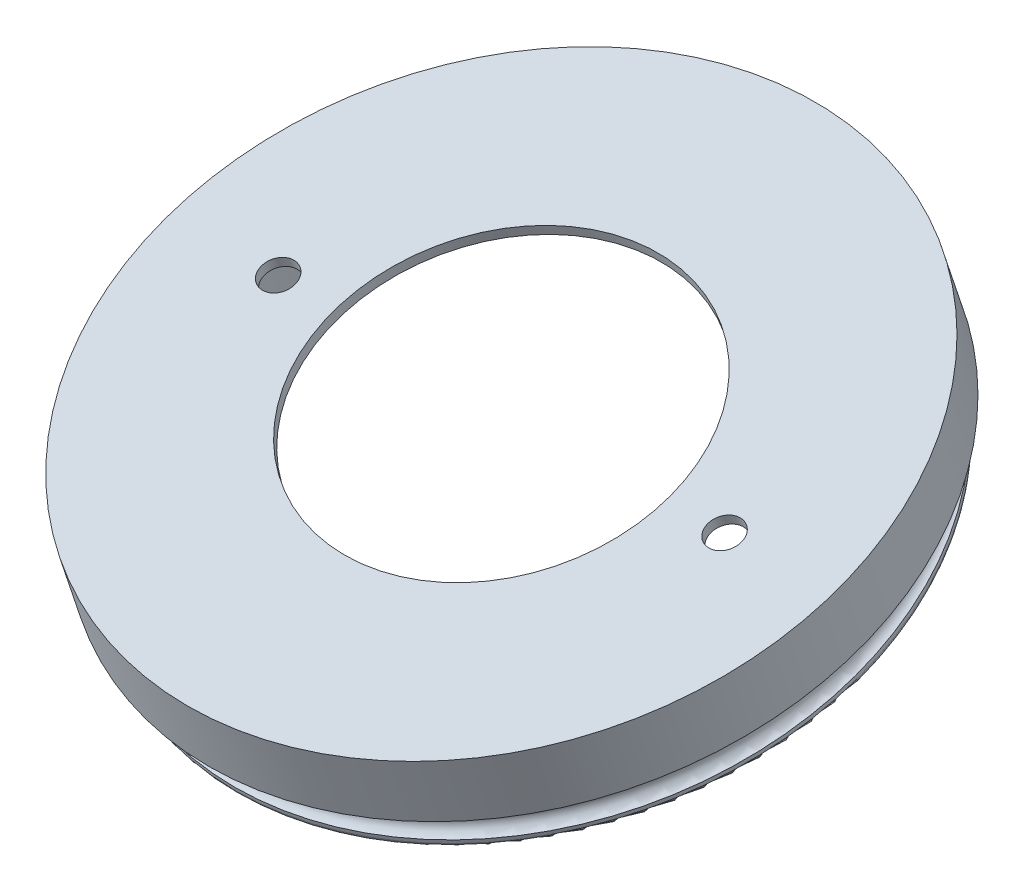
ISO-10303-21;
HEADER;
FILE_DESCRIPTION(('STEP AP214'),'2;1');
FILE_NAME('part.step','',(''),(''),'','','');
FILE_SCHEMA(('AUTOMOTIVE_DESIGN { 1 0 10303 214 1 1 1 1 }'));
ENDSEC;
DATA;
#1=APPLICATION_CONTEXT('core data for automotive mechanical design processes');
#2=APPLICATION_PROTOCOL_DEFINITION('international standard','automotive_design',2000,#1);
#3=PRODUCT_CONTEXT('',#1,'mechanical');
#4=PRODUCT('Part','Part','',(#3));
#5=PRODUCT_RELATED_PRODUCT_CATEGORY('part','',(#4));
#6=PRODUCT_DEFINITION_FORMATION('','',#4);
#7=PRODUCT_DEFINITION_CONTEXT('part definition',#1,'design');
#8=PRODUCT_DEFINITION('design','',#6,#7);
#9=PRODUCT_DEFINITION_SHAPE('','',#8);
#10=(LENGTH_UNIT() NAMED_UNIT(*) SI_UNIT(.MILLI.,.METRE.));
#11=(NAMED_UNIT(*) PLANE_ANGLE_UNIT() SI_UNIT($,.RADIAN.));
#12=(NAMED_UNIT(*) SI_UNIT($,.STERADIAN.) SOLID_ANGLE_UNIT());
#13=UNCERTAINTY_MEASURE_WITH_UNIT(LENGTH_MEASURE(1.E-05),#10,'distance_accuracy_value','');
#14=(GEOMETRIC_REPRESENTATION_CONTEXT(3) GLOBAL_UNCERTAINTY_ASSIGNED_CONTEXT((#13)) GLOBAL_UNIT_ASSIGNED_CONTEXT((#10,
#11,#12)) REPRESENTATION_CONTEXT('',''));
#15=CARTESIAN_POINT('',(0.,0.,0.));
#16=DIRECTION('',(0.,0.,1.));
#17=DIRECTION('',(1.,0.,0.));
#18=AXIS2_PLACEMENT_3D('',#15,#16,#17);
#19=CARTESIAN_POINT('',(0.,0.,0.));
#20=DIRECTION('',(0.,0.948323655206198,0.317304656405097));
#21=DIRECTION('',(0.,-0.317304656405097,0.948323655206198));
#22=AXIS2_PLACEMENT_3D('',#19,#20,#21);
#23=CYLINDRICAL_SURFACE('',#22,38.6);
#24=CARTESIAN_POINT('',(0.,-36.4230710925021,-12.1869891094427));
#25=DIRECTION('',(0.,0.948323655206198,0.317304656405097));
#26=DIRECTION('',(0.,-0.317304656405097,0.948323655206198));
#27=AXIS2_PLACEMENT_3D('',#24,#25,#26);
#28=CIRCLE('',#27,38.6);
#29=CARTESIAN_POINT('',(0.,-48.6710308297389,24.4183039815166));
#30=VERTEX_POINT('',#29);
#31=EDGE_CURVE('E38',#30,#30,#28,.T.);
#32=ORIENTED_EDGE('',*,*,#31,.T.);
#33=EDGE_LOOP('',(#32));
#34=FACE_BOUND('',#33,.T.);
#35=CARTESIAN_POINT('',(0.,-36.8004583771146,-12.3132611285136));
#36=DIRECTION('',(0.,-0.948323655206198,-0.317304656405097));
#37=DIRECTION('',(0.,0.317304656405097,-0.948323655206198));
#38=AXIS2_PLACEMENT_3D('',#35,#36,#37);
#39=CIRCLE('',#38,38.6);
#40=CARTESIAN_POINT('',(0.,-24.5524986398779,-48.9185542194728));
#41=VERTEX_POINT('',#40);
#42=EDGE_CURVE('E42',#41,#41,#39,.T.);
#43=ORIENTED_EDGE('',*,*,#42,.T.);
#44=EDGE_LOOP('',(#43));
#45=FACE_BOUND('',#44,.T.);
#46=ADVANCED_FACE('F31',(#34,#45),#23,.F.);
#47=CARTESIAN_POINT('',(0.,-27.361700493127,-46.8258254924242));
#48=DIRECTION('',(0.,-0.948323655206198,-0.317304656405097));
#49=DIRECTION('',(0.,0.317304656405097,-0.948323655206198));
#50=AXIS2_PLACEMENT_3D('',#47,#48,#49);
#51=PLANE('',#50);
#52=CARTESIAN_POINT('',(0.,-38.697105687527,-12.9478704413238));
#53=DIRECTION('',(0.,-0.948323655206198,-0.317304656405097));
#54=DIRECTION('',(0.,0.317304656405097,-0.948323655206198));
#55=AXIS2_PLACEMENT_3D('',#52,#53,#54);
#56=CIRCLE('',#55,36.6);
#57=CARTESIAN_POINT('',(0.,-27.0837552631004,-47.6565162218706));
#58=VERTEX_POINT('',#57);
#59=EDGE_CURVE('E10',#58,#58,#56,.F.);
#60=ORIENTED_EDGE('',*,*,#59,.T.);
#61=EDGE_LOOP('',(#60));
#62=FACE_BOUND('',#61,.T.);
#63=CARTESIAN_POINT('',(0.,-38.697105687527,-12.9478704413238));
#64=DIRECTION('',(0.,0.948323655206198,0.317304656405097));
#65=DIRECTION('',(0.,-0.317304656405097,0.948323655206198));
#66=AXIS2_PLACEMENT_3D('',#63,#64,#65);
#67=CIRCLE('',#66,35.7240430153924);
#68=CARTESIAN_POINT('',(0.,-50.032510881927,20.9300846097766));
#69=VERTEX_POINT('',#68);
#70=EDGE_CURVE('E63',#69,#69,#67,.T.);
#71=ORIENTED_EDGE('',*,*,#70,.F.);
#72=EDGE_LOOP('',(#71));
#73=FACE_BOUND('',#72,.T.);
#74=ADVANCED_FACE('F137',(#62,#73),#51,.F.);
#75=CARTESIAN_POINT('',(0.,0.,0.));
#76=DIRECTION('',(0.,0.948323655206198,0.317304656405097));
#77=DIRECTION('',(0.,-0.317304656405097,0.948323655206198));
#78=AXIS2_PLACEMENT_3D('',#75,#76,#77);
#79=CYLINDRICAL_SURFACE('',#78,35.7240430153924);
#80=CARTESIAN_POINT('',(0.,-46.2836949291766,-15.4863076925646));
#81=DIRECTION('',(0.,0.948323655206198,0.317304656405097));
#82=DIRECTION('',(0.,-0.317304656405097,0.948323655206198));
#83=AXIS2_PLACEMENT_3D('',#80,#81,#82);
#84=CIRCLE('',#83,35.7240430153924);
#85=CARTESIAN_POINT('',(0.,-57.6191001235765,18.3916473585358));
#86=VERTEX_POINT('',#85);
#87=EDGE_CURVE('E66',#86,#86,#84,.T.);
#88=ORIENTED_EDGE('',*,*,#87,.F.);
#89=EDGE_LOOP('',(#88));
#90=FACE_BOUND('',#89,.T.);
#91=ORIENTED_EDGE('',*,*,#70,.T.);
#92=EDGE_LOOP('',(#91));
#93=FACE_BOUND('',#92,.T.);
#94=ADVANCED_FACE('F142',(#90,#93),#79,.F.);
#95=CARTESIAN_POINT('',(0.,-34.1550280937638,-51.7350718816804));
#96=DIRECTION('',(0.,0.948323655206198,0.317304656405097));
#97=DIRECTION('',(0.,-0.317304656405097,0.948323655206198));
#98=AXIS2_PLACEMENT_3D('',#95,#96,#97);
#99=PLANE('',#98);
#100=CARTESIAN_POINT('',(0.,-46.2836949291765,-15.4863076925646));
#101=DIRECTION('',(0.,0.948323655206198,0.317304656405097));
#102=DIRECTION('',(0.,-0.317304656405097,0.948323655206198));
#103=AXIS2_PLACEMENT_3D('',#100,#101,#102);
#104=CIRCLE('',#103,37.6240430153924);
#105=CARTESIAN_POINT('',(0.,-58.2219789707462,20.1934623034275));
#106=VERTEX_POINT('',#105);
#107=EDGE_CURVE('E51',#106,#106,#104,.F.);
#108=ORIENTED_EDGE('',*,*,#107,.T.);
#109=EDGE_LOOP('',(#108));
#110=FACE_BOUND('',#109,.T.);
#111=ORIENTED_EDGE('',*,*,#87,.T.);
#112=EDGE_LOOP('',(#111));
#113=FACE_BOUND('',#112,.T.);
#114=ADVANCED_FACE('F164',(#110,#113),#99,.F.);
#115=CARTESIAN_POINT('',(0.,0.,0.));
#116=DIRECTION('',(0.,0.948323655206198,0.317304656405097));
#117=DIRECTION('',(0.,-0.317304656405097,0.948323655206198));
#118=AXIS2_PLACEMENT_3D('',#115,#116,#117);
#119=CYLINDRICAL_SURFACE('',#118,38.2240430153924);
#120=CARTESIAN_POINT('',(0.,-45.7147007360528,-15.2959248987215));
#121=DIRECTION('',(0.,0.948323655206198,0.317304656405097));
#122=DIRECTION('',(0.,-0.317304656405097,0.948323655206198));
#123=AXIS2_PLACEMENT_3D('',#120,#121,#122);
#124=CIRCLE('',#123,38.2240430153924);
#125=CARTESIAN_POINT('',(0.,-57.8433675714655,20.9528392903943));
#126=VERTEX_POINT('',#125);
#127=EDGE_CURVE('E54',#126,#126,#124,.T.);
#128=ORIENTED_EDGE('',*,*,#127,.T.);
#129=EDGE_LOOP('',(#128));
#130=FACE_BOUND('',#129,.T.);
#131=CARTESIAN_POINT('',(0.,-45.2618624236965,-15.1444073189159));
#132=DIRECTION('',(0.,0.948323655206198,0.317304656405097));
#133=DIRECTION('',(0.,-0.317304656405097,0.948323655206198));
#134=AXIS2_PLACEMENT_3D('',#131,#132,#133);
#135=CIRCLE('',#134,38.2240430153924);
#136=CARTESIAN_POINT('',(0.,-57.3905292591092,21.1043568702));
#137=VERTEX_POINT('',#136);
#138=EDGE_CURVE('E69',#137,#137,#135,.T.);
#139=ORIENTED_EDGE('',*,*,#138,.F.);
#140=EDGE_LOOP('',(#139));
#141=FACE_BOUND('',#140,.T.);
#142=ADVANCED_FACE('F160',(#130,#141),#119,.T.);
#143=CARTESIAN_POINT('',(0.,-43.912885791161,-14.6930460515518));
#144=DIRECTION('',(0.,0.948323655206198,0.317304656405097));
#145=DIRECTION('',(0.,-0.317304656405097,0.948323655206198));
#146=AXIS2_PLACEMENT_3D('',#143,#144,#145);
#147=TOROIDAL_SURFACE('',#146,38.7,1.5);
#148=CARTESIAN_POINT('',(0.,-42.5496968326323,-14.2369294064312));
#149=DIRECTION('',(0.,-0.948323655206198,-0.317304656405097));
#150=DIRECTION('',(0.,0.317304656405097,-0.948323655206198));
#151=AXIS2_PLACEMENT_3D('',#148,#149,#150);
#152=CIRCLE('',#151,38.2714285714287);
#153=CARTESIAN_POINT('',(0.,-30.4059943396429,-50.5306304392514));
#154=VERTEX_POINT('',#153);
#155=EDGE_CURVE('E57',#154,#154,#152,.T.);
#156=ORIENTED_EDGE('',*,*,#155,.T.);
#157=EDGE_LOOP('',(#156));
#158=FACE_BOUND('',#157,.T.);
#159=ORIENTED_EDGE('',*,*,#138,.T.);
#160=EDGE_LOOP('',(#159));
#161=FACE_BOUND('',#160,.T.);
#162=ADVANCED_FACE('F156',(#158,#161),#147,.F.);
#163=CARTESIAN_POINT('',(0.,0.,0.));
#164=DIRECTION('',(0.,0.948323655206198,0.317304656405097));
#165=DIRECTION('',(0.,-0.317304656405097,0.948323655206198));
#166=AXIS2_PLACEMENT_3D('',#163,#164,#165);
#167=CYLINDRICAL_SURFACE('',#166,38.7);
#168=CARTESIAN_POINT('',(0.,-42.0044212492201,-14.0544827483827));
#169=DIRECTION('',(0.,-0.948323655206198,-0.317304656405097));
#170=DIRECTION('',(0.,0.317304656405097,-0.948323655206198));
#171=AXIS2_PLACEMENT_3D('',#168,#169,#170);
#172=CIRCLE('',#171,38.7);
#173=CARTESIAN_POINT('',(0.,-29.7247310463429,-50.7546082048626));
#174=VERTEX_POINT('',#173);
#175=EDGE_CURVE('E60',#174,#174,#172,.F.);
#176=ORIENTED_EDGE('',*,*,#175,.T.);
#177=EDGE_LOOP('',(#176));
#178=FACE_BOUND('',#177,.T.);
#179=CARTESIAN_POINT('',(0.,-40.9730824600218,-13.709401616696));
#180=DIRECTION('',(0.,0.948323655206198,0.317304656405097));
#181=DIRECTION('',(0.,-0.317304656405097,0.948323655206198));
#182=AXIS2_PLACEMENT_3D('',#179,#180,#181);
#183=CIRCLE('',#182,38.7);
#184=CARTESIAN_POINT('',(0.,-53.2527726628991,22.9907238397838));
#185=VERTEX_POINT('',#184);
#186=EDGE_CURVE('E72',#185,#185,#183,.T.);
#187=ORIENTED_EDGE('',*,*,#186,.F.);
#188=EDGE_LOOP('',(#187));
#189=FACE_BOUND('',#188,.T.);
#190=ADVANCED_FACE('F152',(#178,#189),#167,.T.);
#191=CARTESIAN_POINT('',(0.,-28.280896203818,-51.6423478249439));
#192=DIRECTION('',(0.,0.948323655206198,0.317304656405097));
#193=DIRECTION('',(0.,-0.317304656405097,0.948323655206198));
#194=AXIS2_PLACEMENT_3D('',#191,#192,#193);
#195=PLANE('',#194);
#196=CARTESIAN_POINT('',(0.,-40.9730824600218,-13.709401616696));
#197=DIRECTION('',(0.,0.948323655206198,0.317304656405097));
#198=DIRECTION('',(0.,-0.317304656405097,0.948323655206198));
#199=AXIS2_PLACEMENT_3D('',#196,#197,#198);
#200=CIRCLE('',#199,40.);
#201=CARTESIAN_POINT('',(0.,-53.6652687162257,24.2235445915519));
#202=VERTEX_POINT('',#201);
#203=EDGE_CURVE('E75',#202,#202,#200,.T.);
#204=ORIENTED_EDGE('',*,*,#203,.F.);
#205=EDGE_LOOP('',(#204));
#206=FACE_BOUND('',#205,.T.);
#207=ORIENTED_EDGE('',*,*,#186,.T.);
#208=EDGE_LOOP('',(#207));
#209=FACE_BOUND('',#208,.T.);
#210=ADVANCED_FACE('F148',(#206,#209),#195,.F.);
#211=CARTESIAN_POINT('',(0.,0.,0.));
#212=DIRECTION('',(0.,0.948323655206198,0.317304656405097));
#213=DIRECTION('',(0.,-0.317304656405097,0.948323655206198));
#214=AXIS2_PLACEMENT_3D('',#211,#212,#213);
#215=CYLINDRICAL_SURFACE('',#214,40.);
#216=CARTESIAN_POINT('',(0.,-33.3884353958423,-11.1716142089464));
#217=DIRECTION('',(0.,0.948323655206198,0.317304656405097));
#218=DIRECTION('',(0.,-0.317304656405097,0.948323655206198));
#219=AXIS2_PLACEMENT_3D('',#216,#217,#218);
#220=CIRCLE('',#219,40.);
#221=CARTESIAN_POINT('',(0.,-46.0806216520461,26.7613319993016));
#222=VERTEX_POINT('',#221);
#223=EDGE_CURVE('E78',#222,#222,#220,.T.);
#224=ORIENTED_EDGE('',*,*,#223,.F.);
#225=EDGE_LOOP('',(#224));
#226=FACE_BOUND('',#225,.T.);
#227=ORIENTED_EDGE('',*,*,#203,.T.);
#228=EDGE_LOOP('',(#227));
#229=FACE_BOUND('',#228,.T.);
#230=ADVANCED_FACE('F115',(#226,#229),#215,.T.);
#231=CARTESIAN_POINT('',(0.,-21.1404756586055,-47.7769072999056));
#232=DIRECTION('',(0.,-0.948323655206198,-0.317304656405097));
#233=DIRECTION('',(0.,0.317304656405097,-0.948323655206198));
#234=AXIS2_PLACEMENT_3D('',#231,#232,#233);
#235=PLANE('',#234);
#236=ORIENTED_EDGE('',*,*,#223,.T.);
#237=EDGE_LOOP('',(#236));
#238=FACE_BOUND('',#237,.T.);
#239=CARTESIAN_POINT('',(27.,-33.3884353958423,-11.1716142089464));
#240=DIRECTION('',(0.,0.948323655206198,0.317304656405097));
#241=DIRECTION('',(0.,-0.317304656405097,0.948323655206198));
#242=AXIS2_PLACEMENT_3D('',#239,#240,#241);
#243=CIRCLE('',#242,2.);
#244=CARTESIAN_POINT('',(27.,-34.0230447086525,-9.27496689853397));
#245=VERTEX_POINT('',#244);
#246=EDGE_CURVE('E94',#245,#245,#243,.T.);
#247=ORIENTED_EDGE('',*,*,#246,.F.);
#248=EDGE_LOOP('',(#247));
#249=FACE_BOUND('',#248,.T.);
#250=CARTESIAN_POINT('',(-27.,-33.3884353958423,-11.1716142089464));
#251=DIRECTION('',(0.,0.948323655206198,0.317304656405097));
#252=DIRECTION('',(0.,-0.317304656405097,0.948323655206198));
#253=AXIS2_PLACEMENT_3D('',#250,#251,#252);
#254=CIRCLE('',#253,2.);
#255=CARTESIAN_POINT('',(-27.,-34.0230447086525,-9.27496689853397));
#256=VERTEX_POINT('',#255);
#257=EDGE_CURVE('E88',#256,#256,#254,.T.);
#258=ORIENTED_EDGE('',*,*,#257,.F.);
#259=EDGE_LOOP('',(#258));
#260=FACE_BOUND('',#259,.T.);
#261=CARTESIAN_POINT('',(0.,-33.3884353958423,-11.1716142089464));
#262=DIRECTION('',(0.,0.948323655206198,0.317304656405097));
#263=DIRECTION('',(0.,-0.317304656405097,0.948323655206198));
#264=AXIS2_PLACEMENT_3D('',#261,#262,#263);
#265=CIRCLE('',#264,20.);
#266=CARTESIAN_POINT('',(0.,-39.7345285239442,7.7948588951776));
#267=VERTEX_POINT('',#266);
#268=EDGE_CURVE('E82',#267,#267,#265,.T.);
#269=ORIENTED_EDGE('',*,*,#268,.F.);
#270=EDGE_LOOP('',(#269));
#271=FACE_BOUND('',#270,.T.);
#272=ADVANCED_FACE('F111',(#238,#249,#260,#271),#235,.F.);
#273=CARTESIAN_POINT('',(0.,-42.0044212492201,-14.0544827483827));
#274=DIRECTION('',(0.,-0.948323655206198,-0.317304656405097));
#275=DIRECTION('',(0.,0.317304656405097,-0.948323655206198));
#276=AXIS2_PLACEMENT_3D('',#273,#274,#275);
#277=TOROIDAL_SURFACE('',#276,38.1,0.6);
#278=ORIENTED_EDGE('',*,*,#155,.F.);
#279=EDGE_LOOP('',(#278));
#280=FACE_BOUND('',#279,.T.);
#281=ORIENTED_EDGE('',*,*,#175,.F.);
#282=EDGE_LOOP('',(#281));
#283=FACE_BOUND('',#282,.T.);
#284=ADVANCED_FACE('F114',(#280,#283),#277,.T.);
#285=CARTESIAN_POINT('',(0.,-45.7147007360528,-15.2959248987215));
#286=DIRECTION('',(0.,0.948323655206198,0.317304656405097));
#287=DIRECTION('',(0.,-0.317304656405097,0.948323655206198));
#288=AXIS2_PLACEMENT_3D('',#285,#286,#287);
#289=TOROIDAL_SURFACE('',#288,37.6240430153924,0.6);
#290=ORIENTED_EDGE('',*,*,#107,.F.);
#291=EDGE_LOOP('',(#290));
#292=FACE_BOUND('',#291,.T.);
#293=ORIENTED_EDGE('',*,*,#127,.F.);
#294=EDGE_LOOP('',(#293));
#295=FACE_BOUND('',#294,.T.);
#296=ADVANCED_FACE('F132',(#292,#295),#289,.T.);
#297=CARTESIAN_POINT('',(0.,-34.5264237820897,-11.5523797966325));
#298=DIRECTION('',(0.,0.948323655206198,0.317304656405097));
#299=DIRECTION('',(0.,-0.317304656405097,0.948323655206198));
#300=AXIS2_PLACEMENT_3D('',#297,#298,#299);
#301=PLANE('',#300);
#302=CARTESIAN_POINT('',(0.,-34.5264237820897,-11.5523797966325));
#303=DIRECTION('',(0.,0.948323655206198,0.317304656405097));
#304=DIRECTION('',(0.,-0.317304656405097,0.948323655206198));
#305=AXIS2_PLACEMENT_3D('',#302,#303,#304);
#306=CIRCLE('',#305,36.6);
#307=CARTESIAN_POINT('',(0.,-46.1397742065163,23.1562659839144));
#308=VERTEX_POINT('',#307);
#309=EDGE_CURVE('E46',#308,#308,#306,.F.);
#310=ORIENTED_EDGE('',*,*,#309,.T.);
#311=EDGE_LOOP('',(#310));
#312=FACE_BOUND('',#311,.T.);
#313=CARTESIAN_POINT('',(27.,-34.5264237820897,-11.5523797966325));
#314=DIRECTION('',(0.,0.948323655206198,0.317304656405097));
#315=DIRECTION('',(0.,-0.317304656405097,0.948323655206198));
#316=AXIS2_PLACEMENT_3D('',#313,#314,#315);
#317=CIRCLE('',#316,2.);
#318=CARTESIAN_POINT('',(27.,-35.1610330948999,-9.65573248622009));
#319=VERTEX_POINT('',#318);
#320=EDGE_CURVE('E91',#319,#319,#317,.T.);
#321=ORIENTED_EDGE('',*,*,#320,.T.);
#322=EDGE_LOOP('',(#321));
#323=FACE_BOUND('',#322,.T.);
#324=CARTESIAN_POINT('',(-27.,-34.5264237820897,-11.5523797966325));
#325=DIRECTION('',(0.,0.948323655206198,0.317304656405097));
#326=DIRECTION('',(0.,-0.317304656405097,0.948323655206198));
#327=AXIS2_PLACEMENT_3D('',#324,#325,#326);
#328=CIRCLE('',#327,2.);
#329=CARTESIAN_POINT('',(-27.,-35.1610330948999,-9.65573248622009));
#330=VERTEX_POINT('',#329);
#331=EDGE_CURVE('E85',#330,#330,#328,.T.);
#332=ORIENTED_EDGE('',*,*,#331,.T.);
#333=EDGE_LOOP('',(#332));
#334=FACE_BOUND('',#333,.T.);
#335=CARTESIAN_POINT('',(0.,-34.5264237820897,-11.5523797966325));
#336=DIRECTION('',(0.,0.948323655206198,0.317304656405097));
#337=DIRECTION('',(0.,-0.317304656405097,0.948323655206198));
#338=AXIS2_PLACEMENT_3D('',#335,#336,#337);
#339=CIRCLE('',#338,20.);
#340=CARTESIAN_POINT('',(0.,-40.8725169101917,7.41409330749148));
#341=VERTEX_POINT('',#340);
#342=EDGE_CURVE('E81',#341,#341,#339,.T.);
#343=ORIENTED_EDGE('',*,*,#342,.T.);
#344=EDGE_LOOP('',(#343));
#345=FACE_BOUND('',#344,.T.);
#346=ADVANCED_FACE('F100',(#312,#323,#334,#345),#301,.F.);
#347=CARTESIAN_POINT('',(0.,-34.5264237820897,-11.5523797966325));
#348=DIRECTION('',(0.,0.948323655206198,0.317304656405097));
#349=DIRECTION('',(0.,-0.317304656405097,0.948323655206198));
#350=AXIS2_PLACEMENT_3D('',#347,#348,#349);
#351=CYLINDRICAL_SURFACE('',#350,20.);
#352=ORIENTED_EDGE('',*,*,#342,.F.);
#353=EDGE_LOOP('',(#352));
#354=FACE_BOUND('',#353,.T.);
#355=ORIENTED_EDGE('',*,*,#268,.T.);
#356=EDGE_LOOP('',(#355));
#357=FACE_BOUND('',#356,.T.);
#358=ADVANCED_FACE('F122',(#354,#357),#351,.F.);
#359=CARTESIAN_POINT('',(-27.,-34.5264237820897,-11.5523797966325));
#360=DIRECTION('',(0.,0.948323655206198,0.317304656405097));
#361=DIRECTION('',(0.,-0.317304656405097,0.948323655206198));
#362=AXIS2_PLACEMENT_3D('',#359,#360,#361);
#363=CYLINDRICAL_SURFACE('',#362,2.);
#364=ORIENTED_EDGE('',*,*,#331,.F.);
#365=EDGE_LOOP('',(#364));
#366=FACE_BOUND('',#365,.T.);
#367=ORIENTED_EDGE('',*,*,#257,.T.);
#368=EDGE_LOOP('',(#367));
#369=FACE_BOUND('',#368,.T.);
#370=ADVANCED_FACE('F107',(#366,#369),#363,.F.);
#371=CARTESIAN_POINT('',(27.,-34.5264237820897,-11.5523797966325));
#372=DIRECTION('',(0.,0.948323655206198,0.317304656405097));
#373=DIRECTION('',(0.,-0.317304656405097,0.948323655206198));
#374=AXIS2_PLACEMENT_3D('',#371,#372,#373);
#375=CYLINDRICAL_SURFACE('',#374,2.);
#376=ORIENTED_EDGE('',*,*,#320,.F.);
#377=EDGE_LOOP('',(#376));
#378=FACE_BOUND('',#377,.T.);
#379=ORIENTED_EDGE('',*,*,#246,.T.);
#380=EDGE_LOOP('',(#379));
#381=FACE_BOUND('',#380,.T.);
#382=ADVANCED_FACE('F103',(#378,#381),#375,.F.);
#383=CARTESIAN_POINT('',(0.,-36.4230710925021,-12.1869891094427));
#384=DIRECTION('',(0.,0.948323655206198,0.317304656405097));
#385=DIRECTION('',(0.,-0.317304656405097,0.948323655206198));
#386=AXIS2_PLACEMENT_3D('',#383,#384,#385);
#387=TOROIDAL_SURFACE('',#386,36.6,2.);
#388=ORIENTED_EDGE('',*,*,#31,.F.);
#389=EDGE_LOOP('',(#388));
#390=FACE_BOUND('',#389,.T.);
#391=ORIENTED_EDGE('',*,*,#309,.F.);
#392=EDGE_LOOP('',(#391));
#393=FACE_BOUND('',#392,.T.);
#394=ADVANCED_FACE('F106',(#390,#393),#387,.F.);
#395=CARTESIAN_POINT('',(0.,-36.8004583771146,-12.3132611285136));
#396=DIRECTION('',(0.,-0.948323655206198,-0.317304656405097));
#397=DIRECTION('',(0.,0.317304656405097,-0.948323655206198));
#398=AXIS2_PLACEMENT_3D('',#395,#396,#397);
#399=TOROIDAL_SURFACE('',#398,36.6,2.);
#400=ORIENTED_EDGE('',*,*,#42,.F.);
#401=EDGE_LOOP('',(#400));
#402=FACE_BOUND('',#401,.T.);
#403=ORIENTED_EDGE('',*,*,#59,.F.);
#404=EDGE_LOOP('',(#403));
#405=FACE_BOUND('',#404,.T.);
#406=ADVANCED_FACE('F33',(#402,#405),#399,.F.);
#407=CLOSED_SHELL('',(#46,#74,#94,#114,#142,#162,#190,#210,#230,#272,#284,#296,#346,#358,#370,
#382,#394,#406));
#408=MANIFOLD_SOLID_BREP('B2',#407);
#409=ADVANCED_BREP_SHAPE_REPRESENTATION('',(#18,#408),#14);
#410=SHAPE_DEFINITION_REPRESENTATION(#9,#409);
ENDSEC;
END-ISO-10303-21;
